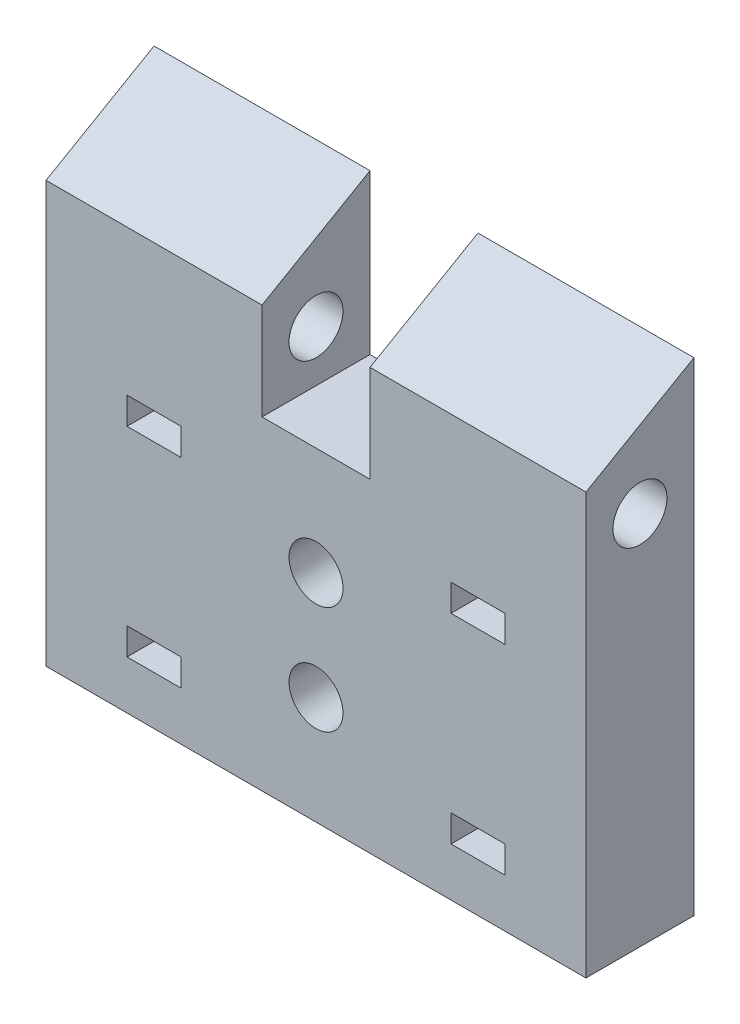
ISO-10303-21;
HEADER;
FILE_DESCRIPTION(('STEP AP214'),'2;1');
FILE_NAME('part.step','',(''),(''),'','','');
FILE_SCHEMA(('AUTOMOTIVE_DESIGN { 1 0 10303 214 1 1 1 1 }'));
ENDSEC;
DATA;
#1=APPLICATION_CONTEXT('core data for automotive mechanical design processes');
#2=APPLICATION_PROTOCOL_DEFINITION('international standard','automotive_design',2000,#1);
#3=PRODUCT_CONTEXT('',#1,'mechanical');
#4=PRODUCT('Part','Part','',(#3));
#5=PRODUCT_RELATED_PRODUCT_CATEGORY('part','',(#4));
#6=PRODUCT_DEFINITION_FORMATION('','',#4);
#7=PRODUCT_DEFINITION_CONTEXT('part definition',#1,'design');
#8=PRODUCT_DEFINITION('design','',#6,#7);
#9=PRODUCT_DEFINITION_SHAPE('','',#8);
#10=(LENGTH_UNIT() NAMED_UNIT(*) SI_UNIT(.MILLI.,.METRE.));
#11=(NAMED_UNIT(*) PLANE_ANGLE_UNIT() SI_UNIT($,.RADIAN.));
#12=(NAMED_UNIT(*) SI_UNIT($,.STERADIAN.) SOLID_ANGLE_UNIT());
#13=UNCERTAINTY_MEASURE_WITH_UNIT(LENGTH_MEASURE(1.E-05),#10,'distance_accuracy_value','');
#14=(GEOMETRIC_REPRESENTATION_CONTEXT(3) GLOBAL_UNCERTAINTY_ASSIGNED_CONTEXT((#13)) GLOBAL_UNIT_ASSIGNED_CONTEXT((#10,
#11,#12)) REPRESENTATION_CONTEXT('',''));
#15=CARTESIAN_POINT('',(0.,0.,0.));
#16=DIRECTION('',(0.,0.,1.));
#17=DIRECTION('',(1.,0.,0.));
#18=AXIS2_PLACEMENT_3D('',#15,#16,#17);
#19=CARTESIAN_POINT('',(0.,-15.,10.));
#20=DIRECTION('',(0.,-1.,0.));
#21=DIRECTION('',(1.,0.,0.));
#22=AXIS2_PLACEMENT_3D('',#19,#20,#21);
#23=PLANE('',#22);
#24=DIRECTION('',(-1.,0.,0.));
#25=VECTOR('',#24,1.);
#26=CARTESIAN_POINT('',(0.,-15.,0.));
#27=LINE('',#26,#25);
#28=CARTESIAN_POINT('',(25.,-15.,0.));
#29=VERTEX_POINT('',#28);
#30=CARTESIAN_POINT('',(-25.,-15.,0.));
#31=VERTEX_POINT('',#30);
#32=EDGE_CURVE('E373',#29,#31,#27,.T.);
#33=ORIENTED_EDGE('',*,*,#32,.F.);
#34=DIRECTION('',(0.,0.,-1.));
#35=VECTOR('',#34,1.);
#36=CARTESIAN_POINT('',(25.,-15.,10.));
#37=LINE('',#36,#35);
#38=CARTESIAN_POINT('',(25.,-15.,10.));
#39=VERTEX_POINT('',#38);
#40=EDGE_CURVE('E11',#39,#29,#37,.T.);
#41=ORIENTED_EDGE('',*,*,#40,.F.);
#42=DIRECTION('',(-1.,0.,0.));
#43=VECTOR('',#42,1.);
#44=CARTESIAN_POINT('',(0.,-15.,10.));
#45=LINE('',#44,#43);
#46=CARTESIAN_POINT('',(-25.,-15.,10.));
#47=VERTEX_POINT('',#46);
#48=EDGE_CURVE('E349',#39,#47,#45,.T.);
#49=ORIENTED_EDGE('',*,*,#48,.T.);
#50=DIRECTION('',(0.,0.,-1.));
#51=VECTOR('',#50,1.);
#52=CARTESIAN_POINT('',(-25.,-15.,10.));
#53=LINE('',#52,#51);
#54=EDGE_CURVE('E367',#47,#31,#53,.T.);
#55=ORIENTED_EDGE('',*,*,#54,.T.);
#56=EDGE_LOOP('',(#33,#41,#49,#55));
#57=FACE_BOUND('',#56,.T.);
#58=ADVANCED_FACE('F35',(#57),#23,.T.);
#59=CARTESIAN_POINT('',(25.,0.,10.));
#60=DIRECTION('',(-1.,0.,0.));
#61=DIRECTION('',(0.,-1.,0.));
#62=AXIS2_PLACEMENT_3D('',#59,#60,#61);
#63=PLANE('',#62);
#64=CARTESIAN_POINT('',(25.,19.75,5.));
#65=DIRECTION('',(-1.,0.,0.));
#66=DIRECTION('',(0.,-1.,0.));
#67=AXIS2_PLACEMENT_3D('',#64,#65,#66);
#68=CIRCLE('',#67,2.5);
#69=CARTESIAN_POINT('',(25.,19.75,7.5));
#70=VERTEX_POINT('',#69);
#71=EDGE_CURVE('E319',#70,#70,#68,.F.);
#72=ORIENTED_EDGE('',*,*,#71,.F.);
#73=EDGE_LOOP('',(#72));
#74=FACE_BOUND('',#73,.T.);
#75=DIRECTION('',(0.,1.,0.));
#76=VECTOR('',#75,1.);
#77=CARTESIAN_POINT('',(25.,0.,0.));
#78=LINE('',#77,#76);
#79=CARTESIAN_POINT('',(25.,29.75,0.));
#80=VERTEX_POINT('',#79);
#81=EDGE_CURVE('E376',#29,#80,#78,.T.);
#82=ORIENTED_EDGE('',*,*,#81,.T.);
#83=DIRECTION('',(0.,0.499999999999994,-0.866025403784442));
#84=VECTOR('',#83,1.);
#85=CARTESIAN_POINT('',(25.,23.9764973081038,10.));
#86=LINE('',#85,#84);
#87=CARTESIAN_POINT('',(25.,23.9764973081038,10.));
#88=VERTEX_POINT('',#87);
#89=EDGE_CURVE('E329',#88,#80,#86,.T.);
#90=ORIENTED_EDGE('',*,*,#89,.F.);
#91=DIRECTION('',(0.,1.,0.));
#92=VECTOR('',#91,1.);
#93=CARTESIAN_POINT('',(25.,0.,10.));
#94=LINE('',#93,#92);
#95=EDGE_CURVE('E352',#39,#88,#94,.T.);
#96=ORIENTED_EDGE('',*,*,#95,.F.);
#97=ORIENTED_EDGE('',*,*,#40,.T.);
#98=EDGE_LOOP('',(#82,#90,#96,#97));
#99=FACE_BOUND('',#98,.T.);
#100=ADVANCED_FACE('F422',(#74,#99),#63,.F.);
#101=CARTESIAN_POINT('',(5.,0.,10.));
#102=DIRECTION('',(-1.,0.,0.));
#103=DIRECTION('',(0.,0.,1.));
#104=AXIS2_PLACEMENT_3D('',#101,#102,#103);
#105=PLANE('',#104);
#106=CARTESIAN_POINT('',(5.,19.75,5.));
#107=DIRECTION('',(-1.,0.,0.));
#108=DIRECTION('',(0.,0.,1.));
#109=AXIS2_PLACEMENT_3D('',#106,#107,#108);
#110=CIRCLE('',#109,2.5);
#111=CARTESIAN_POINT('',(5.,19.75,7.5));
#112=VERTEX_POINT('',#111);
#113=EDGE_CURVE('E325',#112,#112,#110,.T.);
#114=ORIENTED_EDGE('',*,*,#113,.F.);
#115=EDGE_LOOP('',(#114));
#116=FACE_BOUND('',#115,.T.);
#117=DIRECTION('',(0.,-0.499999999999994,0.866025403784442));
#118=VECTOR('',#117,1.);
#119=CARTESIAN_POINT('',(5.,17.982372981078,20.3821278812935));
#120=LINE('',#119,#118);
#121=CARTESIAN_POINT('',(5.00000000000001,29.75,0.));
#122=VERTEX_POINT('',#121);
#123=CARTESIAN_POINT('',(5.00000000000001,23.9764973081038,10.));
#124=VERTEX_POINT('',#123);
#125=EDGE_CURVE('E339',#122,#124,#120,.T.);
#126=ORIENTED_EDGE('',*,*,#125,.F.);
#127=DIRECTION('',(0.,1.,0.));
#128=VECTOR('',#127,1.);
#129=CARTESIAN_POINT('',(5.,0.,0.));
#130=LINE('',#129,#128);
#131=CARTESIAN_POINT('',(5.,15.,0.));
#132=VERTEX_POINT('',#131);
#133=EDGE_CURVE('E382',#132,#122,#130,.T.);
#134=ORIENTED_EDGE('',*,*,#133,.F.);
#135=DIRECTION('',(0.,0.,-1.));
#136=VECTOR('',#135,1.);
#137=CARTESIAN_POINT('',(5.,15.,10.));
#138=LINE('',#137,#136);
#139=CARTESIAN_POINT('',(5.,15.,10.));
#140=VERTEX_POINT('',#139);
#141=EDGE_CURVE('E43',#140,#132,#138,.T.);
#142=ORIENTED_EDGE('',*,*,#141,.F.);
#143=DIRECTION('',(0.,1.,0.));
#144=VECTOR('',#143,1.);
#145=CARTESIAN_POINT('',(5.,0.,10.));
#146=LINE('',#145,#144);
#147=EDGE_CURVE('E355',#140,#124,#146,.T.);
#148=ORIENTED_EDGE('',*,*,#147,.T.);
#149=EDGE_LOOP('',(#126,#134,#142,#148));
#150=FACE_BOUND('',#149,.T.);
#151=ADVANCED_FACE('F405',(#116,#150),#105,.T.);
#152=CARTESIAN_POINT('',(0.,15.,10.));
#153=DIRECTION('',(0.,1.,0.));
#154=DIRECTION('',(0.,0.,1.));
#155=AXIS2_PLACEMENT_3D('',#152,#153,#154);
#156=PLANE('',#155);
#157=DIRECTION('',(1.,0.,0.));
#158=VECTOR('',#157,1.);
#159=CARTESIAN_POINT('',(0.,15.,0.));
#160=LINE('',#159,#158);
#161=CARTESIAN_POINT('',(-5.,15.,0.));
#162=VERTEX_POINT('',#161);
#163=EDGE_CURVE('E385',#162,#132,#160,.T.);
#164=ORIENTED_EDGE('',*,*,#163,.F.);
#165=DIRECTION('',(0.,0.,-1.));
#166=VECTOR('',#165,1.);
#167=CARTESIAN_POINT('',(-5.,15.,10.));
#168=LINE('',#167,#166);
#169=CARTESIAN_POINT('',(-5.,15.,10.));
#170=VERTEX_POINT('',#169);
#171=EDGE_CURVE('E396',#170,#162,#168,.T.);
#172=ORIENTED_EDGE('',*,*,#171,.F.);
#173=DIRECTION('',(1.,0.,0.));
#174=VECTOR('',#173,1.);
#175=CARTESIAN_POINT('',(0.,15.,10.));
#176=LINE('',#175,#174);
#177=EDGE_CURVE('E358',#170,#140,#176,.T.);
#178=ORIENTED_EDGE('',*,*,#177,.T.);
#179=ORIENTED_EDGE('',*,*,#141,.T.);
#180=EDGE_LOOP('',(#164,#172,#178,#179));
#181=FACE_BOUND('',#180,.T.);
#182=ADVANCED_FACE('F400',(#181),#156,.T.);
#183=CARTESIAN_POINT('',(-5.,0.,10.));
#184=DIRECTION('',(-1.,0.,0.));
#185=DIRECTION('',(0.,0.,1.));
#186=AXIS2_PLACEMENT_3D('',#183,#184,#185);
#187=PLANE('',#186);
#188=CARTESIAN_POINT('',(-5.,19.75,5.));
#189=DIRECTION('',(-1.,0.,0.));
#190=DIRECTION('',(0.,0.,1.));
#191=AXIS2_PLACEMENT_3D('',#188,#189,#190);
#192=CIRCLE('',#191,2.5);
#193=CARTESIAN_POINT('',(-5.,19.75,7.5));
#194=VERTEX_POINT('',#193);
#195=EDGE_CURVE('E322',#194,#194,#192,.T.);
#196=ORIENTED_EDGE('',*,*,#195,.T.);
#197=EDGE_LOOP('',(#196));
#198=FACE_BOUND('',#197,.T.);
#199=DIRECTION('',(0.,1.,0.));
#200=VECTOR('',#199,1.);
#201=CARTESIAN_POINT('',(-5.,0.,0.));
#202=LINE('',#201,#200);
#203=CARTESIAN_POINT('',(-5.,29.75,0.));
#204=VERTEX_POINT('',#203);
#205=EDGE_CURVE('E388',#162,#204,#202,.T.);
#206=ORIENTED_EDGE('',*,*,#205,.T.);
#207=DIRECTION('',(0.,-0.499999999999994,0.866025403784442));
#208=VECTOR('',#207,1.);
#209=CARTESIAN_POINT('',(-5.,17.982372981078,20.3821278812935));
#210=LINE('',#209,#208);
#211=CARTESIAN_POINT('',(-4.99999999999999,23.9764973081038,10.));
#212=VERTEX_POINT('',#211);
#213=EDGE_CURVE('E331',#204,#212,#210,.T.);
#214=ORIENTED_EDGE('',*,*,#213,.T.);
#215=DIRECTION('',(0.,1.,0.));
#216=VECTOR('',#215,1.);
#217=CARTESIAN_POINT('',(-5.,0.,10.));
#218=LINE('',#217,#216);
#219=EDGE_CURVE('E361',#170,#212,#218,.T.);
#220=ORIENTED_EDGE('',*,*,#219,.F.);
#221=ORIENTED_EDGE('',*,*,#171,.T.);
#222=EDGE_LOOP('',(#206,#214,#220,#221));
#223=FACE_BOUND('',#222,.T.);
#224=ADVANCED_FACE('F411',(#198,#223),#187,.F.);
#225=CARTESIAN_POINT('',(0.,-5.,10.));
#226=DIRECTION('',(0.,0.,-1.));
#227=DIRECTION('',(-1.,0.,0.));
#228=AXIS2_PLACEMENT_3D('',#225,#226,#227);
#229=CYLINDRICAL_SURFACE('',#228,2.5);
#230=CARTESIAN_POINT('',(0.,-5.,10.));
#231=DIRECTION('',(0.,0.,1.));
#232=DIRECTION('',(1.,0.,0.));
#233=AXIS2_PLACEMENT_3D('',#230,#231,#232);
#234=CIRCLE('',#233,2.5);
#235=CARTESIAN_POINT('',(2.5,-5.,10.));
#236=VERTEX_POINT('',#235);
#237=EDGE_CURVE('E345',#236,#236,#234,.T.);
#238=ORIENTED_EDGE('',*,*,#237,.T.);
#239=EDGE_LOOP('',(#238));
#240=FACE_BOUND('',#239,.T.);
#241=CARTESIAN_POINT('',(0.,-5.,0.));
#242=DIRECTION('',(0.,0.,1.));
#243=DIRECTION('',(1.,0.,0.));
#244=AXIS2_PLACEMENT_3D('',#241,#242,#243);
#245=CIRCLE('',#244,2.5);
#246=CARTESIAN_POINT('',(2.5,-5.,0.));
#247=VERTEX_POINT('',#246);
#248=EDGE_CURVE('E370',#247,#247,#245,.T.);
#249=ORIENTED_EDGE('',*,*,#248,.F.);
#250=EDGE_LOOP('',(#249));
#251=FACE_BOUND('',#250,.T.);
#252=ADVANCED_FACE('F452',(#240,#251),#229,.F.);
#253=CARTESIAN_POINT('',(0.,5.,10.));
#254=DIRECTION('',(0.,0.,-1.));
#255=DIRECTION('',(-1.,0.,0.));
#256=AXIS2_PLACEMENT_3D('',#253,#254,#255);
#257=CYLINDRICAL_SURFACE('',#256,2.5);
#258=CARTESIAN_POINT('',(0.,5.,10.));
#259=DIRECTION('',(0.,0.,1.));
#260=DIRECTION('',(1.,0.,0.));
#261=AXIS2_PLACEMENT_3D('',#258,#259,#260);
#262=CIRCLE('',#261,2.5);
#263=CARTESIAN_POINT('',(2.5,5.,10.));
#264=VERTEX_POINT('',#263);
#265=EDGE_CURVE('E342',#264,#264,#262,.T.);
#266=ORIENTED_EDGE('',*,*,#265,.T.);
#267=EDGE_LOOP('',(#266));
#268=FACE_BOUND('',#267,.T.);
#269=CARTESIAN_POINT('',(0.,5.,0.));
#270=DIRECTION('',(0.,0.,1.));
#271=DIRECTION('',(1.,0.,0.));
#272=AXIS2_PLACEMENT_3D('',#269,#270,#271);
#273=CIRCLE('',#272,2.5);
#274=CARTESIAN_POINT('',(2.5,5.,0.));
#275=VERTEX_POINT('',#274);
#276=EDGE_CURVE('E341',#275,#275,#273,.T.);
#277=ORIENTED_EDGE('',*,*,#276,.F.);
#278=EDGE_LOOP('',(#277));
#279=FACE_BOUND('',#278,.T.);
#280=ADVANCED_FACE('F37',(#268,#279),#257,.F.);
#281=CARTESIAN_POINT('',(-25.,0.,10.));
#282=DIRECTION('',(-1.,0.,0.));
#283=DIRECTION('',(0.,-1.,0.));
#284=AXIS2_PLACEMENT_3D('',#281,#282,#283);
#285=PLANE('',#284);
#286=CARTESIAN_POINT('',(-25.,19.75,5.));
#287=DIRECTION('',(-1.,0.,0.));
#288=DIRECTION('',(0.,0.,1.));
#289=AXIS2_PLACEMENT_3D('',#286,#287,#288);
#290=CIRCLE('',#289,2.5);
#291=CARTESIAN_POINT('',(-25.,19.75,7.5));
#292=VERTEX_POINT('',#291);
#293=EDGE_CURVE('E316',#292,#292,#290,.T.);
#294=ORIENTED_EDGE('',*,*,#293,.F.);
#295=EDGE_LOOP('',(#294));
#296=FACE_BOUND('',#295,.T.);
#297=DIRECTION('',(0.,-0.499999999999994,0.866025403784442));
#298=VECTOR('',#297,1.);
#299=CARTESIAN_POINT('',(-25.,23.9764973081038,10.));
#300=LINE('',#299,#298);
#301=CARTESIAN_POINT('',(-25.,29.75,0.));
#302=VERTEX_POINT('',#301);
#303=CARTESIAN_POINT('',(-25.,23.9764973081038,10.));
#304=VERTEX_POINT('',#303);
#305=EDGE_CURVE('E328',#302,#304,#300,.T.);
#306=ORIENTED_EDGE('',*,*,#305,.F.);
#307=DIRECTION('',(0.,1.,0.));
#308=VECTOR('',#307,1.);
#309=CARTESIAN_POINT('',(-25.,0.,0.));
#310=LINE('',#309,#308);
#311=EDGE_CURVE('E346',#31,#302,#310,.T.);
#312=ORIENTED_EDGE('',*,*,#311,.F.);
#313=ORIENTED_EDGE('',*,*,#54,.F.);
#314=DIRECTION('',(0.,1.,0.));
#315=VECTOR('',#314,1.);
#316=CARTESIAN_POINT('',(-25.,0.,10.));
#317=LINE('',#316,#315);
#318=EDGE_CURVE('E364',#47,#304,#317,.T.);
#319=ORIENTED_EDGE('',*,*,#318,.T.);
#320=EDGE_LOOP('',(#306,#312,#313,#319));
#321=FACE_BOUND('',#320,.T.);
#322=ADVANCED_FACE('F430',(#296,#321),#285,.T.);
#323=CARTESIAN_POINT('',(0.,0.,10.));
#324=DIRECTION('',(0.,0.,1.));
#325=DIRECTION('',(1.,0.,0.));
#326=AXIS2_PLACEMENT_3D('',#323,#324,#325);
#327=PLANE('',#326);
#328=DIRECTION('',(0.,1.,0.));
#329=VECTOR('',#328,1.);
#330=CARTESIAN_POINT('',(-12.5,-10.5,10.));
#331=LINE('',#330,#329);
#332=CARTESIAN_POINT('',(-12.5,-10.5,10.));
#333=VERTEX_POINT('',#332);
#334=CARTESIAN_POINT('',(-12.5,-8.,10.));
#335=VERTEX_POINT('',#334);
#336=EDGE_CURVE('E50',#333,#335,#331,.T.);
#337=ORIENTED_EDGE('',*,*,#336,.F.);
#338=DIRECTION('',(1.,0.,0.));
#339=VECTOR('',#338,1.);
#340=CARTESIAN_POINT('',(-17.5,-10.5,10.));
#341=LINE('',#340,#339);
#342=CARTESIAN_POINT('',(-17.5,-10.5,10.));
#343=VERTEX_POINT('',#342);
#344=EDGE_CURVE('E219',#343,#333,#341,.T.);
#345=ORIENTED_EDGE('',*,*,#344,.F.);
#346=DIRECTION('',(0.,-1.,0.));
#347=VECTOR('',#346,1.);
#348=CARTESIAN_POINT('',(-17.5,-10.5,10.));
#349=LINE('',#348,#347);
#350=CARTESIAN_POINT('',(-17.5,-8.,10.));
#351=VERTEX_POINT('',#350);
#352=EDGE_CURVE('E202',#351,#343,#349,.T.);
#353=ORIENTED_EDGE('',*,*,#352,.F.);
#354=DIRECTION('',(-1.,0.,0.));
#355=VECTOR('',#354,1.);
#356=CARTESIAN_POINT('',(-17.5,-8.,10.));
#357=LINE('',#356,#355);
#358=EDGE_CURVE('E212',#335,#351,#357,.T.);
#359=ORIENTED_EDGE('',*,*,#358,.F.);
#360=EDGE_LOOP('',(#337,#345,#353,#359));
#361=FACE_BOUND('',#360,.T.);
#362=DIRECTION('',(1.,0.,0.));
#363=VECTOR('',#362,1.);
#364=CARTESIAN_POINT('',(17.5,-10.5,10.));
#365=LINE('',#364,#363);
#366=CARTESIAN_POINT('',(12.5,-10.5,10.));
#367=VERTEX_POINT('',#366);
#368=CARTESIAN_POINT('',(17.5,-10.5,10.));
#369=VERTEX_POINT('',#368);
#370=EDGE_CURVE('E58',#367,#369,#365,.T.);
#371=ORIENTED_EDGE('',*,*,#370,.F.);
#372=DIRECTION('',(0.,-1.,0.));
#373=VECTOR('',#372,1.);
#374=CARTESIAN_POINT('',(12.5,-10.5,10.));
#375=LINE('',#374,#373);
#376=CARTESIAN_POINT('',(12.5,-8.,10.));
#377=VERTEX_POINT('',#376);
#378=EDGE_CURVE('E249',#377,#367,#375,.T.);
#379=ORIENTED_EDGE('',*,*,#378,.F.);
#380=DIRECTION('',(-1.,0.,0.));
#381=VECTOR('',#380,1.);
#382=CARTESIAN_POINT('',(17.5,-8.,10.));
#383=LINE('',#382,#381);
#384=CARTESIAN_POINT('',(17.5,-8.,10.));
#385=VERTEX_POINT('',#384);
#386=EDGE_CURVE('E246',#385,#377,#383,.T.);
#387=ORIENTED_EDGE('',*,*,#386,.F.);
#388=DIRECTION('',(0.,1.,0.));
#389=VECTOR('',#388,1.);
#390=CARTESIAN_POINT('',(17.5,-10.5,10.));
#391=LINE('',#390,#389);
#392=EDGE_CURVE('E242',#369,#385,#391,.T.);
#393=ORIENTED_EDGE('',*,*,#392,.F.);
#394=EDGE_LOOP('',(#371,#379,#387,#393));
#395=FACE_BOUND('',#394,.T.);
#396=DIRECTION('',(-1.,0.,0.));
#397=VECTOR('',#396,1.);
#398=CARTESIAN_POINT('',(17.5,10.5,10.));
#399=LINE('',#398,#397);
#400=CARTESIAN_POINT('',(17.5,10.5,10.));
#401=VERTEX_POINT('',#400);
#402=CARTESIAN_POINT('',(12.5,10.5,10.));
#403=VERTEX_POINT('',#402);
#404=EDGE_CURVE('E268',#401,#403,#399,.T.);
#405=ORIENTED_EDGE('',*,*,#404,.F.);
#406=DIRECTION('',(0.,1.,0.));
#407=VECTOR('',#406,1.);
#408=CARTESIAN_POINT('',(17.5,8.,10.));
#409=LINE('',#408,#407);
#410=CARTESIAN_POINT('',(17.5,8.,10.));
#411=VERTEX_POINT('',#410);
#412=EDGE_CURVE('E276',#411,#401,#409,.T.);
#413=ORIENTED_EDGE('',*,*,#412,.F.);
#414=DIRECTION('',(1.,0.,0.));
#415=VECTOR('',#414,1.);
#416=CARTESIAN_POINT('',(17.5,8.,10.));
#417=LINE('',#416,#415);
#418=CARTESIAN_POINT('',(12.5,8.,10.));
#419=VERTEX_POINT('',#418);
#420=EDGE_CURVE('E273',#419,#411,#417,.T.);
#421=ORIENTED_EDGE('',*,*,#420,.F.);
#422=DIRECTION('',(0.,-1.,0.));
#423=VECTOR('',#422,1.);
#424=CARTESIAN_POINT('',(12.5,8.,10.));
#425=LINE('',#424,#423);
#426=EDGE_CURVE('E270',#403,#419,#425,.T.);
#427=ORIENTED_EDGE('',*,*,#426,.F.);
#428=EDGE_LOOP('',(#405,#413,#421,#427));
#429=FACE_BOUND('',#428,.T.);
#430=DIRECTION('',(0.,1.,0.));
#431=VECTOR('',#430,1.);
#432=CARTESIAN_POINT('',(-12.5,8.,10.));
#433=LINE('',#432,#431);
#434=CARTESIAN_POINT('',(-12.5,8.,10.));
#435=VERTEX_POINT('',#434);
#436=CARTESIAN_POINT('',(-12.5,10.5,10.));
#437=VERTEX_POINT('',#436);
#438=EDGE_CURVE('E230',#435,#437,#433,.T.);
#439=ORIENTED_EDGE('',*,*,#438,.F.);
#440=DIRECTION('',(1.,0.,0.));
#441=VECTOR('',#440,1.);
#442=CARTESIAN_POINT('',(-17.5,8.,10.));
#443=LINE('',#442,#441);
#444=CARTESIAN_POINT('',(-17.5,8.,10.));
#445=VERTEX_POINT('',#444);
#446=EDGE_CURVE('E304',#445,#435,#443,.T.);
#447=ORIENTED_EDGE('',*,*,#446,.F.);
#448=DIRECTION('',(0.,-1.,0.));
#449=VECTOR('',#448,1.);
#450=CARTESIAN_POINT('',(-17.5,8.,10.));
#451=LINE('',#450,#449);
#452=CARTESIAN_POINT('',(-17.5,10.5,10.));
#453=VERTEX_POINT('',#452);
#454=EDGE_CURVE('E301',#453,#445,#451,.T.);
#455=ORIENTED_EDGE('',*,*,#454,.F.);
#456=DIRECTION('',(-1.,0.,0.));
#457=VECTOR('',#456,1.);
#458=CARTESIAN_POINT('',(-17.5,10.5,10.));
#459=LINE('',#458,#457);
#460=EDGE_CURVE('E298',#437,#453,#459,.T.);
#461=ORIENTED_EDGE('',*,*,#460,.F.);
#462=EDGE_LOOP('',(#439,#447,#455,#461));
#463=FACE_BOUND('',#462,.T.);
#464=DIRECTION('',(-1.,0.,0.));
#465=VECTOR('',#464,1.);
#466=CARTESIAN_POINT('',(36.5470053837925,23.9764973081038,10.));
#467=LINE('',#466,#465);
#468=EDGE_CURVE('E334',#212,#304,#467,.T.);
#469=ORIENTED_EDGE('',*,*,#468,.T.);
#470=ORIENTED_EDGE('',*,*,#318,.F.);
#471=ORIENTED_EDGE('',*,*,#48,.F.);
#472=ORIENTED_EDGE('',*,*,#95,.T.);
#473=EDGE_CURVE('E332',#88,#124,#467,.T.);
#474=ORIENTED_EDGE('',*,*,#473,.T.);
#475=ORIENTED_EDGE('',*,*,#147,.F.);
#476=ORIENTED_EDGE('',*,*,#177,.F.);
#477=ORIENTED_EDGE('',*,*,#219,.T.);
#478=EDGE_LOOP('',(#469,#470,#471,#472,#474,#475,#476,#477));
#479=FACE_BOUND('',#478,.T.);
#480=ORIENTED_EDGE('',*,*,#265,.F.);
#481=EDGE_LOOP('',(#480));
#482=FACE_BOUND('',#481,.T.);
#483=ORIENTED_EDGE('',*,*,#237,.F.);
#484=EDGE_LOOP('',(#483));
#485=FACE_BOUND('',#484,.T.);
#486=ADVANCED_FACE('F216',(#361,#395,#429,#463,#479,#482,#485),#327,.T.);
#487=CARTESIAN_POINT('',(0.,0.,0.));
#488=DIRECTION('',(0.,0.,1.));
#489=DIRECTION('',(1.,0.,0.));
#490=AXIS2_PLACEMENT_3D('',#487,#488,#489);
#491=PLANE('',#490);
#492=DIRECTION('',(-1.,0.,0.));
#493=VECTOR('',#492,1.);
#494=CARTESIAN_POINT('',(-17.5,-10.5,0.));
#495=LINE('',#494,#493);
#496=CARTESIAN_POINT('',(-12.5,-10.5,0.));
#497=VERTEX_POINT('',#496);
#498=CARTESIAN_POINT('',(-17.5,-10.5,0.));
#499=VERTEX_POINT('',#498);
#500=EDGE_CURVE('E551',#497,#499,#495,.T.);
#501=ORIENTED_EDGE('',*,*,#500,.F.);
#502=DIRECTION('',(0.,-1.,0.));
#503=VECTOR('',#502,1.);
#504=CARTESIAN_POINT('',(-12.5,-10.5,0.));
#505=LINE('',#504,#503);
#506=CARTESIAN_POINT('',(-12.5,-8.,0.));
#507=VERTEX_POINT('',#506);
#508=EDGE_CURVE('E231',#507,#497,#505,.T.);
#509=ORIENTED_EDGE('',*,*,#508,.F.);
#510=DIRECTION('',(1.,0.,0.));
#511=VECTOR('',#510,1.);
#512=CARTESIAN_POINT('',(-17.5,-8.,0.));
#513=LINE('',#512,#511);
#514=CARTESIAN_POINT('',(-17.5,-8.,0.));
#515=VERTEX_POINT('',#514);
#516=EDGE_CURVE('E228',#515,#507,#513,.T.);
#517=ORIENTED_EDGE('',*,*,#516,.F.);
#518=DIRECTION('',(0.,1.,0.));
#519=VECTOR('',#518,1.);
#520=CARTESIAN_POINT('',(-17.5,-10.5,0.));
#521=LINE('',#520,#519);
#522=EDGE_CURVE('E205',#499,#515,#521,.T.);
#523=ORIENTED_EDGE('',*,*,#522,.F.);
#524=EDGE_LOOP('',(#501,#509,#517,#523));
#525=FACE_BOUND('',#524,.T.);
#526=DIRECTION('',(0.,1.,0.));
#527=VECTOR('',#526,1.);
#528=CARTESIAN_POINT('',(12.5,-10.5,0.));
#529=LINE('',#528,#527);
#530=CARTESIAN_POINT('',(12.5,-10.5,0.));
#531=VERTEX_POINT('',#530);
#532=CARTESIAN_POINT('',(12.5,-8.,0.));
#533=VERTEX_POINT('',#532);
#534=EDGE_CURVE('E235',#531,#533,#529,.T.);
#535=ORIENTED_EDGE('',*,*,#534,.F.);
#536=DIRECTION('',(-1.,0.,0.));
#537=VECTOR('',#536,1.);
#538=CARTESIAN_POINT('',(17.5,-10.5,0.));
#539=LINE('',#538,#537);
#540=CARTESIAN_POINT('',(17.5,-10.5,0.));
#541=VERTEX_POINT('',#540);
#542=EDGE_CURVE('E238',#541,#531,#539,.T.);
#543=ORIENTED_EDGE('',*,*,#542,.F.);
#544=DIRECTION('',(0.,-1.,0.));
#545=VECTOR('',#544,1.);
#546=CARTESIAN_POINT('',(17.5,-10.5,0.));
#547=LINE('',#546,#545);
#548=CARTESIAN_POINT('',(17.5,-8.,0.));
#549=VERTEX_POINT('',#548);
#550=EDGE_CURVE('E240',#549,#541,#547,.T.);
#551=ORIENTED_EDGE('',*,*,#550,.F.);
#552=DIRECTION('',(1.,0.,0.));
#553=VECTOR('',#552,1.);
#554=CARTESIAN_POINT('',(17.5,-8.,0.));
#555=LINE('',#554,#553);
#556=EDGE_CURVE('E232',#533,#549,#555,.T.);
#557=ORIENTED_EDGE('',*,*,#556,.F.);
#558=EDGE_LOOP('',(#535,#543,#551,#557));
#559=FACE_BOUND('',#558,.T.);
#560=DIRECTION('',(0.,-1.,0.));
#561=VECTOR('',#560,1.);
#562=CARTESIAN_POINT('',(17.5,8.,0.));
#563=LINE('',#562,#561);
#564=CARTESIAN_POINT('',(17.5,10.5,0.));
#565=VERTEX_POINT('',#564);
#566=CARTESIAN_POINT('',(17.5,8.,0.));
#567=VERTEX_POINT('',#566);
#568=EDGE_CURVE('E263',#565,#567,#563,.T.);
#569=ORIENTED_EDGE('',*,*,#568,.F.);
#570=DIRECTION('',(1.,0.,0.));
#571=VECTOR('',#570,1.);
#572=CARTESIAN_POINT('',(17.5,10.5,0.));
#573=LINE('',#572,#571);
#574=CARTESIAN_POINT('',(12.5,10.5,0.));
#575=VERTEX_POINT('',#574);
#576=EDGE_CURVE('E266',#575,#565,#573,.T.);
#577=ORIENTED_EDGE('',*,*,#576,.F.);
#578=DIRECTION('',(0.,1.,0.));
#579=VECTOR('',#578,1.);
#580=CARTESIAN_POINT('',(12.5,8.,0.));
#581=LINE('',#580,#579);
#582=CARTESIAN_POINT('',(12.5,8.,0.));
#583=VERTEX_POINT('',#582);
#584=EDGE_CURVE('E243',#583,#575,#581,.T.);
#585=ORIENTED_EDGE('',*,*,#584,.F.);
#586=DIRECTION('',(-1.,0.,0.));
#587=VECTOR('',#586,1.);
#588=CARTESIAN_POINT('',(17.5,8.,0.));
#589=LINE('',#588,#587);
#590=EDGE_CURVE('E260',#567,#583,#589,.T.);
#591=ORIENTED_EDGE('',*,*,#590,.F.);
#592=EDGE_LOOP('',(#569,#577,#585,#591));
#593=FACE_BOUND('',#592,.T.);
#594=DIRECTION('',(-1.,0.,0.));
#595=VECTOR('',#594,1.);
#596=CARTESIAN_POINT('',(-17.5,8.,0.));
#597=LINE('',#596,#595);
#598=CARTESIAN_POINT('',(-12.5,8.,0.));
#599=VERTEX_POINT('',#598);
#600=CARTESIAN_POINT('',(-17.5,8.,0.));
#601=VERTEX_POINT('',#600);
#602=EDGE_CURVE('E291',#599,#601,#597,.T.);
#603=ORIENTED_EDGE('',*,*,#602,.F.);
#604=DIRECTION('',(0.,-1.,0.));
#605=VECTOR('',#604,1.);
#606=CARTESIAN_POINT('',(-12.5,8.,0.));
#607=LINE('',#606,#605);
#608=CARTESIAN_POINT('',(-12.5,10.5,0.));
#609=VERTEX_POINT('',#608);
#610=EDGE_CURVE('E294',#609,#599,#607,.T.);
#611=ORIENTED_EDGE('',*,*,#610,.F.);
#612=DIRECTION('',(1.,0.,0.));
#613=VECTOR('',#612,1.);
#614=CARTESIAN_POINT('',(-17.5,10.5,0.));
#615=LINE('',#614,#613);
#616=CARTESIAN_POINT('',(-17.5,10.5,0.));
#617=VERTEX_POINT('',#616);
#618=EDGE_CURVE('E296',#617,#609,#615,.T.);
#619=ORIENTED_EDGE('',*,*,#618,.F.);
#620=DIRECTION('',(0.,1.,0.));
#621=VECTOR('',#620,1.);
#622=CARTESIAN_POINT('',(-17.5,8.,0.));
#623=LINE('',#622,#621);
#624=EDGE_CURVE('E288',#601,#617,#623,.T.);
#625=ORIENTED_EDGE('',*,*,#624,.F.);
#626=EDGE_LOOP('',(#603,#611,#619,#625));
#627=FACE_BOUND('',#626,.T.);
#628=ORIENTED_EDGE('',*,*,#276,.T.);
#629=EDGE_LOOP('',(#628));
#630=FACE_BOUND('',#629,.T.);
#631=ORIENTED_EDGE('',*,*,#248,.T.);
#632=EDGE_LOOP('',(#631));
#633=FACE_BOUND('',#632,.T.);
#634=ORIENTED_EDGE('',*,*,#32,.T.);
#635=ORIENTED_EDGE('',*,*,#311,.T.);
#636=DIRECTION('',(-1.,0.,0.));
#637=VECTOR('',#636,1.);
#638=CARTESIAN_POINT('',(0.,29.75,0.));
#639=LINE('',#638,#637);
#640=EDGE_CURVE('E391',#204,#302,#639,.T.);
#641=ORIENTED_EDGE('',*,*,#640,.F.);
#642=ORIENTED_EDGE('',*,*,#205,.F.);
#643=ORIENTED_EDGE('',*,*,#163,.T.);
#644=ORIENTED_EDGE('',*,*,#133,.T.);
#645=DIRECTION('',(1.,0.,0.));
#646=VECTOR('',#645,1.);
#647=CARTESIAN_POINT('',(0.,29.75,0.));
#648=LINE('',#647,#646);
#649=EDGE_CURVE('E379',#122,#80,#648,.T.);
#650=ORIENTED_EDGE('',*,*,#649,.T.);
#651=ORIENTED_EDGE('',*,*,#81,.F.);
#652=EDGE_LOOP('',(#634,#635,#641,#642,#643,#644,#650,#651));
#653=FACE_BOUND('',#652,.T.);
#654=ADVANCED_FACE('F408',(#525,#559,#593,#627,#630,#633,#653),#491,.F.);
#655=CARTESIAN_POINT('',(36.5470053837925,23.9764973081038,10.));
#656=DIRECTION('',(0.,-0.866025403784442,-0.499999999999994));
#657=DIRECTION('',(0.,0.499999999999994,-0.866025403784442));
#658=AXIS2_PLACEMENT_3D('',#655,#656,#657);
#659=PLANE('',#658);
#660=ORIENTED_EDGE('',*,*,#640,.T.);
#661=ORIENTED_EDGE('',*,*,#305,.T.);
#662=ORIENTED_EDGE('',*,*,#468,.F.);
#663=ORIENTED_EDGE('',*,*,#213,.F.);
#664=EDGE_LOOP('',(#660,#661,#662,#663));
#665=FACE_BOUND('',#664,.T.);
#666=ADVANCED_FACE('F432',(#665),#659,.F.);
#667=ORIENTED_EDGE('',*,*,#125,.T.);
#668=ORIENTED_EDGE('',*,*,#473,.F.);
#669=ORIENTED_EDGE('',*,*,#89,.T.);
#670=ORIENTED_EDGE('',*,*,#649,.F.);
#671=EDGE_LOOP('',(#667,#668,#669,#670));
#672=FACE_BOUND('',#671,.T.);
#673=ADVANCED_FACE('F420',(#672),#659,.F.);
#674=CARTESIAN_POINT('',(36.5470053837925,19.75,5.));
#675=DIRECTION('',(-1.,0.,0.));
#676=DIRECTION('',(0.,0.,1.));
#677=AXIS2_PLACEMENT_3D('',#674,#675,#676);
#678=CYLINDRICAL_SURFACE('',#677,2.5);
#679=CARTESIAN_POINT('',(-25.,19.75,7.5));
#680=CARTESIAN_POINT('',(-24.7916666666667,19.75,7.5));
#681=CARTESIAN_POINT('',(-24.5833333333333,19.75,7.5));
#682=CARTESIAN_POINT('',(-24.1666666666667,19.75,7.5));
#683=CARTESIAN_POINT('',(-23.9583333333333,19.75,7.5));
#684=CARTESIAN_POINT('',(-23.5416666666667,19.75,7.5));
#685=CARTESIAN_POINT('',(-23.3333333333333,19.75,7.5));
#686=CARTESIAN_POINT('',(-22.9166666666667,19.75,7.5));
#687=CARTESIAN_POINT('',(-22.7083333333333,19.75,7.5));
#688=CARTESIAN_POINT('',(-22.2916666666667,19.75,7.5));
#689=CARTESIAN_POINT('',(-22.0833333333333,19.75,7.5));
#690=CARTESIAN_POINT('',(-21.6666666666667,19.75,7.5));
#691=CARTESIAN_POINT('',(-21.4583333333333,19.75,7.5));
#692=CARTESIAN_POINT('',(-21.0416666666667,19.75,7.5));
#693=CARTESIAN_POINT('',(-20.8333333333333,19.75,7.5));
#694=CARTESIAN_POINT('',(-20.4166666666667,19.75,7.5));
#695=CARTESIAN_POINT('',(-20.2083333333333,19.75,7.5));
#696=CARTESIAN_POINT('',(-19.7916666666667,19.75,7.5));
#697=CARTESIAN_POINT('',(-19.5833333333333,19.75,7.5));
#698=CARTESIAN_POINT('',(-19.1666666666667,19.75,7.5));
#699=CARTESIAN_POINT('',(-18.9583333333333,19.75,7.5));
#700=CARTESIAN_POINT('',(-18.5416666666667,19.75,7.5));
#701=CARTESIAN_POINT('',(-18.3333333333333,19.75,7.5));
#702=CARTESIAN_POINT('',(-17.9166666666667,19.75,7.5));
#703=CARTESIAN_POINT('',(-17.7083333333333,19.75,7.5));
#704=CARTESIAN_POINT('',(-17.2916666666667,19.75,7.5));
#705=CARTESIAN_POINT('',(-17.0833333333333,19.75,7.5));
#706=CARTESIAN_POINT('',(-16.6666666666667,19.75,7.5));
#707=CARTESIAN_POINT('',(-16.4583333333333,19.75,7.5));
#708=CARTESIAN_POINT('',(-16.0416666666667,19.75,7.5));
#709=CARTESIAN_POINT('',(-15.8333333333333,19.75,7.5));
#710=CARTESIAN_POINT('',(-15.4166666666667,19.75,7.5));
#711=CARTESIAN_POINT('',(-15.2083333333333,19.75,7.5));
#712=CARTESIAN_POINT('',(-14.7916666666667,19.75,7.5));
#713=CARTESIAN_POINT('',(-14.5833333333333,19.75,7.5));
#714=CARTESIAN_POINT('',(-14.1666666666667,19.75,7.5));
#715=CARTESIAN_POINT('',(-13.9583333333333,19.75,7.5));
#716=CARTESIAN_POINT('',(-13.5416666666667,19.75,7.5));
#717=CARTESIAN_POINT('',(-13.3333333333333,19.75,7.5));
#718=CARTESIAN_POINT('',(-12.9166666666667,19.75,7.5));
#719=CARTESIAN_POINT('',(-12.7083333333333,19.75,7.5));
#720=CARTESIAN_POINT('',(-12.2916666666667,19.75,7.5));
#721=CARTESIAN_POINT('',(-12.0833333333333,19.75,7.5));
#722=CARTESIAN_POINT('',(-11.6666666666667,19.75,7.5));
#723=CARTESIAN_POINT('',(-11.4583333333333,19.75,7.5));
#724=CARTESIAN_POINT('',(-11.0416666666667,19.75,7.5));
#725=CARTESIAN_POINT('',(-10.8333333333333,19.75,7.5));
#726=CARTESIAN_POINT('',(-10.4166666666667,19.75,7.5));
#727=CARTESIAN_POINT('',(-10.2083333333333,19.75,7.5));
#728=CARTESIAN_POINT('',(-9.79166666666666,19.75,7.5));
#729=CARTESIAN_POINT('',(-9.58333333333333,19.75,7.5));
#730=CARTESIAN_POINT('',(-9.16666666666666,19.75,7.5));
#731=CARTESIAN_POINT('',(-8.95833333333333,19.75,7.5));
#732=CARTESIAN_POINT('',(-8.54166666666666,19.75,7.5));
#733=CARTESIAN_POINT('',(-8.33333333333333,19.75,7.5));
#734=CARTESIAN_POINT('',(-7.91666666666667,19.75,7.5));
#735=CARTESIAN_POINT('',(-7.70833333333333,19.75,7.5));
#736=CARTESIAN_POINT('',(-7.29166666666667,19.75,7.5));
#737=CARTESIAN_POINT('',(-7.08333333333333,19.75,7.5));
#738=CARTESIAN_POINT('',(-6.66666666666667,19.75,7.5));
#739=CARTESIAN_POINT('',(-6.45833333333333,19.75,7.5));
#740=CARTESIAN_POINT('',(-6.04166666666667,19.75,7.5));
#741=CARTESIAN_POINT('',(-5.83333333333333,19.75,7.5));
#742=CARTESIAN_POINT('',(-5.41666666666666,19.75,7.5));
#743=CARTESIAN_POINT('',(-5.20833333333333,19.75,7.5));
#744=CARTESIAN_POINT('',(-5.,19.75,7.5));
#745=B_SPLINE_CURVE_WITH_KNOTS('',3,(#679,#680,#681,#682,#683,#684,#685,#686,#687,#688,#689,
#690,#691,#692,#693,#694,#695,#696,#697,#698,#699,#700,#701,#702,#703,#704,#705,#706,#707,#708,
#709,#710,#711,#712,#713,#714,#715,#716,#717,#718,#719,#720,#721,#722,#723,#724,#725,#726,#727,
#728,#729,#730,#731,#732,#733,#734,#735,#736,#737,#738,#739,#740,#741,#742,#743,#744),
.UNSPECIFIED.,.F.,.F.,(4,2,2,2,2,2,2,2,2,2,2,2,2,2,2,2,2,2,2,2,2,2,2,2,2,2,2,2,2,2,2,2,4),(0.,
0.625000000000001,1.25,1.875,2.5,3.125,3.75,4.375,5.,5.625,6.25,6.875,7.49999999999999,
8.12499999999999,8.74999999999999,9.37499999999999,9.99999999999999,10.625,11.25,11.875,12.5,
13.125,13.75,14.375,15.,15.625,16.25,16.875,17.5,18.125,18.75,19.375,20.),.UNSPECIFIED.);
#746=EDGE_CURVE('BSEAM439',#292,#194,#745,.T.);
#747=ORIENTED_EDGE('',*,*,#293,.T.);
#748=ORIENTED_EDGE('',*,*,#195,.F.);
#749=ORIENTED_EDGE('',*,*,#746,.T.);
#750=ORIENTED_EDGE('',*,*,#746,.F.);
#751=EDGE_LOOP('',(#747,#749,#748,#750));
#752=FACE_BOUND('',#751,.T.);
#753=ADVANCED_FACE('F439',(#752),#678,.F.);
#754=CARTESIAN_POINT('',(5.,19.75,7.5));
#755=CARTESIAN_POINT('',(5.20833333333333,19.75,7.5));
#756=CARTESIAN_POINT('',(5.41666666666666,19.75,7.5));
#757=CARTESIAN_POINT('',(5.83333333333333,19.75,7.5));
#758=CARTESIAN_POINT('',(6.04166666666666,19.75,7.5));
#759=CARTESIAN_POINT('',(6.45833333333333,19.75,7.5));
#760=CARTESIAN_POINT('',(6.66666666666666,19.75,7.5));
#761=CARTESIAN_POINT('',(7.08333333333333,19.75,7.5));
#762=CARTESIAN_POINT('',(7.29166666666666,19.75,7.5));
#763=CARTESIAN_POINT('',(7.70833333333333,19.75,7.5));
#764=CARTESIAN_POINT('',(7.91666666666666,19.75,7.5));
#765=CARTESIAN_POINT('',(8.33333333333333,19.75,7.5));
#766=CARTESIAN_POINT('',(8.54166666666666,19.75,7.5));
#767=CARTESIAN_POINT('',(8.95833333333333,19.75,7.5));
#768=CARTESIAN_POINT('',(9.16666666666666,19.75,7.5));
#769=CARTESIAN_POINT('',(9.58333333333333,19.75,7.5));
#770=CARTESIAN_POINT('',(9.79166666666666,19.75,7.5));
#771=CARTESIAN_POINT('',(10.2083333333333,19.75,7.5));
#772=CARTESIAN_POINT('',(10.4166666666667,19.75,7.5));
#773=CARTESIAN_POINT('',(10.8333333333333,19.75,7.5));
#774=CARTESIAN_POINT('',(11.0416666666667,19.75,7.5));
#775=CARTESIAN_POINT('',(11.4583333333333,19.75,7.5));
#776=CARTESIAN_POINT('',(11.6666666666667,19.75,7.5));
#777=CARTESIAN_POINT('',(12.0833333333333,19.75,7.5));
#778=CARTESIAN_POINT('',(12.2916666666667,19.75,7.5));
#779=CARTESIAN_POINT('',(12.7083333333333,19.75,7.5));
#780=CARTESIAN_POINT('',(12.9166666666667,19.75,7.5));
#781=CARTESIAN_POINT('',(13.3333333333333,19.75,7.5));
#782=CARTESIAN_POINT('',(13.5416666666667,19.75,7.5));
#783=CARTESIAN_POINT('',(13.9583333333333,19.75,7.5));
#784=CARTESIAN_POINT('',(14.1666666666667,19.75,7.5));
#785=CARTESIAN_POINT('',(14.5833333333333,19.75,7.5));
#786=CARTESIAN_POINT('',(14.7916666666667,19.75,7.5));
#787=CARTESIAN_POINT('',(15.2083333333333,19.75,7.5));
#788=CARTESIAN_POINT('',(15.4166666666667,19.75,7.5));
#789=CARTESIAN_POINT('',(15.8333333333333,19.75,7.5));
#790=CARTESIAN_POINT('',(16.0416666666667,19.75,7.5));
#791=CARTESIAN_POINT('',(16.4583333333333,19.75,7.5));
#792=CARTESIAN_POINT('',(16.6666666666667,19.75,7.5));
#793=CARTESIAN_POINT('',(17.0833333333333,19.75,7.5));
#794=CARTESIAN_POINT('',(17.2916666666667,19.75,7.5));
#795=CARTESIAN_POINT('',(17.7083333333333,19.75,7.5));
#796=CARTESIAN_POINT('',(17.9166666666667,19.75,7.5));
#797=CARTESIAN_POINT('',(18.3333333333333,19.75,7.5));
#798=CARTESIAN_POINT('',(18.5416666666667,19.75,7.5));
#799=CARTESIAN_POINT('',(18.9583333333333,19.75,7.5));
#800=CARTESIAN_POINT('',(19.1666666666667,19.75,7.5));
#801=CARTESIAN_POINT('',(19.5833333333333,19.75,7.5));
#802=CARTESIAN_POINT('',(19.7916666666667,19.75,7.5));
#803=CARTESIAN_POINT('',(20.2083333333333,19.75,7.5));
#804=CARTESIAN_POINT('',(20.4166666666667,19.75,7.5));
#805=CARTESIAN_POINT('',(20.8333333333333,19.75,7.5));
#806=CARTESIAN_POINT('',(21.0416666666667,19.75,7.5));
#807=CARTESIAN_POINT('',(21.4583333333333,19.75,7.5));
#808=CARTESIAN_POINT('',(21.6666666666667,19.75,7.5));
#809=CARTESIAN_POINT('',(22.0833333333333,19.75,7.5));
#810=CARTESIAN_POINT('',(22.2916666666667,19.75,7.5));
#811=CARTESIAN_POINT('',(22.7083333333333,19.75,7.5));
#812=CARTESIAN_POINT('',(22.9166666666667,19.75,7.5));
#813=CARTESIAN_POINT('',(23.3333333333333,19.75,7.5));
#814=CARTESIAN_POINT('',(23.5416666666667,19.75,7.5));
#815=CARTESIAN_POINT('',(23.9583333333333,19.75,7.5));
#816=CARTESIAN_POINT('',(24.1666666666667,19.75,7.5));
#817=CARTESIAN_POINT('',(24.5833333333333,19.75,7.5));
#818=CARTESIAN_POINT('',(24.7916666666667,19.75,7.5));
#819=CARTESIAN_POINT('',(25.,19.75,7.5));
#820=B_SPLINE_CURVE_WITH_KNOTS('',3,(#754,#755,#756,#757,#758,#759,#760,#761,#762,#763,#764,
#765,#766,#767,#768,#769,#770,#771,#772,#773,#774,#775,#776,#777,#778,#779,#780,#781,#782,#783,
#784,#785,#786,#787,#788,#789,#790,#791,#792,#793,#794,#795,#796,#797,#798,#799,#800,#801,#802,
#803,#804,#805,#806,#807,#808,#809,#810,#811,#812,#813,#814,#815,#816,#817,#818,#819),
.UNSPECIFIED.,.F.,.F.,(4,2,2,2,2,2,2,2,2,2,2,2,2,2,2,2,2,2,2,2,2,2,2,2,2,2,2,2,2,2,2,2,4),(0.,
0.624999999999997,1.25,1.875,2.5,3.125,3.75,4.375,5.,5.625,6.25,6.875,7.5,8.125,8.75,9.375,10.,
10.625,11.25,11.875,12.5,13.125,13.75,14.375,15.,15.625,16.25,16.875,17.5,18.125,18.75,19.375,
20.),.UNSPECIFIED.);
#821=EDGE_CURVE('BSEAM481',#112,#70,#820,.T.);
#822=ORIENTED_EDGE('',*,*,#113,.T.);
#823=ORIENTED_EDGE('',*,*,#71,.T.);
#824=ORIENTED_EDGE('',*,*,#821,.T.);
#825=ORIENTED_EDGE('',*,*,#821,.F.);
#826=EDGE_LOOP('',(#822,#824,#823,#825));
#827=FACE_BOUND('',#826,.T.);
#828=ADVANCED_FACE('F481',(#827),#678,.F.);
#829=CARTESIAN_POINT('',(-12.5,8.,-5.59016994374947));
#830=DIRECTION('',(1.,0.,0.));
#831=DIRECTION('',(0.,0.,-1.));
#832=AXIS2_PLACEMENT_3D('',#829,#830,#831);
#833=PLANE('',#832);
#834=ORIENTED_EDGE('',*,*,#610,.T.);
#835=DIRECTION('',(0.,0.,1.));
#836=VECTOR('',#835,1.);
#837=CARTESIAN_POINT('',(-12.5,8.,-5.59016994374947));
#838=LINE('',#837,#836);
#839=EDGE_CURVE('E292',#599,#435,#838,.T.);
#840=ORIENTED_EDGE('',*,*,#839,.T.);
#841=ORIENTED_EDGE('',*,*,#438,.T.);
#842=DIRECTION('',(0.,0.,1.));
#843=VECTOR('',#842,1.);
#844=CARTESIAN_POINT('',(-12.5,10.5,-5.59016994374947));
#845=LINE('',#844,#843);
#846=EDGE_CURVE('E307',#609,#437,#845,.T.);
#847=ORIENTED_EDGE('',*,*,#846,.F.);
#848=EDGE_LOOP('',(#834,#840,#841,#847));
#849=FACE_BOUND('',#848,.T.);
#850=ADVANCED_FACE('F484',(#849),#833,.F.);
#851=CARTESIAN_POINT('',(-17.5,8.,-5.59016994374947));
#852=DIRECTION('',(0.,-1.,0.));
#853=DIRECTION('',(0.,0.,-1.));
#854=AXIS2_PLACEMENT_3D('',#851,#852,#853);
#855=PLANE('',#854);
#856=ORIENTED_EDGE('',*,*,#602,.T.);
#857=DIRECTION('',(0.,0.,1.));
#858=VECTOR('',#857,1.);
#859=CARTESIAN_POINT('',(-17.5,8.,-5.59016994374947));
#860=LINE('',#859,#858);
#861=EDGE_CURVE('E309',#601,#445,#860,.T.);
#862=ORIENTED_EDGE('',*,*,#861,.T.);
#863=ORIENTED_EDGE('',*,*,#446,.T.);
#864=ORIENTED_EDGE('',*,*,#839,.F.);
#865=EDGE_LOOP('',(#856,#862,#863,#864));
#866=FACE_BOUND('',#865,.T.);
#867=ADVANCED_FACE('F490',(#866),#855,.F.);
#868=CARTESIAN_POINT('',(-17.5,8.,-5.59016994374947));
#869=DIRECTION('',(-1.,0.,0.));
#870=DIRECTION('',(0.,0.,1.));
#871=AXIS2_PLACEMENT_3D('',#868,#869,#870);
#872=PLANE('',#871);
#873=ORIENTED_EDGE('',*,*,#624,.T.);
#874=DIRECTION('',(0.,0.,1.));
#875=VECTOR('',#874,1.);
#876=CARTESIAN_POINT('',(-17.5,10.5,-5.59016994374947));
#877=LINE('',#876,#875);
#878=EDGE_CURVE('E311',#617,#453,#877,.T.);
#879=ORIENTED_EDGE('',*,*,#878,.T.);
#880=ORIENTED_EDGE('',*,*,#454,.T.);
#881=ORIENTED_EDGE('',*,*,#861,.F.);
#882=EDGE_LOOP('',(#873,#879,#880,#881));
#883=FACE_BOUND('',#882,.T.);
#884=ADVANCED_FACE('F499',(#883),#872,.F.);
#885=CARTESIAN_POINT('',(-17.5,10.5,-5.59016994374947));
#886=DIRECTION('',(0.,1.,0.));
#887=DIRECTION('',(0.,0.,1.));
#888=AXIS2_PLACEMENT_3D('',#885,#886,#887);
#889=PLANE('',#888);
#890=ORIENTED_EDGE('',*,*,#618,.T.);
#891=ORIENTED_EDGE('',*,*,#846,.T.);
#892=ORIENTED_EDGE('',*,*,#460,.T.);
#893=ORIENTED_EDGE('',*,*,#878,.F.);
#894=EDGE_LOOP('',(#890,#891,#892,#893));
#895=FACE_BOUND('',#894,.T.);
#896=ADVANCED_FACE('F495',(#895),#889,.F.);
#897=CARTESIAN_POINT('',(17.5,10.5,-5.59016994374947));
#898=DIRECTION('',(0.,1.,0.));
#899=DIRECTION('',(0.,0.,1.));
#900=AXIS2_PLACEMENT_3D('',#897,#898,#899);
#901=PLANE('',#900);
#902=ORIENTED_EDGE('',*,*,#576,.T.);
#903=DIRECTION('',(0.,0.,1.));
#904=VECTOR('',#903,1.);
#905=CARTESIAN_POINT('',(17.5,10.5,-5.59016994374947));
#906=LINE('',#905,#904);
#907=EDGE_CURVE('E264',#565,#401,#906,.T.);
#908=ORIENTED_EDGE('',*,*,#907,.T.);
#909=ORIENTED_EDGE('',*,*,#404,.T.);
#910=DIRECTION('',(0.,0.,1.));
#911=VECTOR('',#910,1.);
#912=CARTESIAN_POINT('',(12.5,10.5,-5.59016994374947));
#913=LINE('',#912,#911);
#914=EDGE_CURVE('E279',#575,#403,#913,.T.);
#915=ORIENTED_EDGE('',*,*,#914,.F.);
#916=EDGE_LOOP('',(#902,#908,#909,#915));
#917=FACE_BOUND('',#916,.T.);
#918=ADVANCED_FACE('F498',(#917),#901,.F.);
#919=CARTESIAN_POINT('',(17.5,8.,-5.59016994374947));
#920=DIRECTION('',(1.,0.,0.));
#921=DIRECTION('',(0.,0.,-1.));
#922=AXIS2_PLACEMENT_3D('',#919,#920,#921);
#923=PLANE('',#922);
#924=ORIENTED_EDGE('',*,*,#568,.T.);
#925=DIRECTION('',(0.,0.,1.));
#926=VECTOR('',#925,1.);
#927=CARTESIAN_POINT('',(17.5,8.,-5.59016994374947));
#928=LINE('',#927,#926);
#929=EDGE_CURVE('E281',#567,#411,#928,.T.);
#930=ORIENTED_EDGE('',*,*,#929,.T.);
#931=ORIENTED_EDGE('',*,*,#412,.T.);
#932=ORIENTED_EDGE('',*,*,#907,.F.);
#933=EDGE_LOOP('',(#924,#930,#931,#932));
#934=FACE_BOUND('',#933,.T.);
#935=ADVANCED_FACE('F509',(#934),#923,.F.);
#936=CARTESIAN_POINT('',(17.5,8.,-5.59016994374947));
#937=DIRECTION('',(0.,-1.,0.));
#938=DIRECTION('',(0.,0.,-1.));
#939=AXIS2_PLACEMENT_3D('',#936,#937,#938);
#940=PLANE('',#939);
#941=ORIENTED_EDGE('',*,*,#590,.T.);
#942=DIRECTION('',(0.,0.,1.));
#943=VECTOR('',#942,1.);
#944=CARTESIAN_POINT('',(12.5,8.,-5.59016994374947));
#945=LINE('',#944,#943);
#946=EDGE_CURVE('E283',#583,#419,#945,.T.);
#947=ORIENTED_EDGE('',*,*,#946,.T.);
#948=ORIENTED_EDGE('',*,*,#420,.T.);
#949=ORIENTED_EDGE('',*,*,#929,.F.);
#950=EDGE_LOOP('',(#941,#947,#948,#949));
#951=FACE_BOUND('',#950,.T.);
#952=ADVANCED_FACE('F515',(#951),#940,.F.);
#953=CARTESIAN_POINT('',(12.5,8.,-5.59016994374947));
#954=DIRECTION('',(-1.,0.,0.));
#955=DIRECTION('',(0.,0.,1.));
#956=AXIS2_PLACEMENT_3D('',#953,#954,#955);
#957=PLANE('',#956);
#958=ORIENTED_EDGE('',*,*,#584,.T.);
#959=ORIENTED_EDGE('',*,*,#914,.T.);
#960=ORIENTED_EDGE('',*,*,#426,.T.);
#961=ORIENTED_EDGE('',*,*,#946,.F.);
#962=EDGE_LOOP('',(#958,#959,#960,#961));
#963=FACE_BOUND('',#962,.T.);
#964=ADVANCED_FACE('F511',(#963),#957,.F.);
#965=CARTESIAN_POINT('',(17.5,-10.5,-5.59016994374947));
#966=DIRECTION('',(0.,-1.,0.));
#967=DIRECTION('',(0.,0.,-1.));
#968=AXIS2_PLACEMENT_3D('',#965,#966,#967);
#969=PLANE('',#968);
#970=ORIENTED_EDGE('',*,*,#542,.T.);
#971=DIRECTION('',(0.,0.,1.));
#972=VECTOR('',#971,1.);
#973=CARTESIAN_POINT('',(12.5,-10.5,-5.59016994374947));
#974=LINE('',#973,#972);
#975=EDGE_CURVE('E236',#531,#367,#974,.T.);
#976=ORIENTED_EDGE('',*,*,#975,.T.);
#977=ORIENTED_EDGE('',*,*,#370,.T.);
#978=DIRECTION('',(0.,0.,1.));
#979=VECTOR('',#978,1.);
#980=CARTESIAN_POINT('',(17.5,-10.5,-5.59016994374947));
#981=LINE('',#980,#979);
#982=EDGE_CURVE('E252',#541,#369,#981,.T.);
#983=ORIENTED_EDGE('',*,*,#982,.F.);
#984=EDGE_LOOP('',(#970,#976,#977,#983));
#985=FACE_BOUND('',#984,.T.);
#986=ADVANCED_FACE('F514',(#985),#969,.F.);
#987=CARTESIAN_POINT('',(12.5,-10.5,-5.59016994374947));
#988=DIRECTION('',(-1.,0.,0.));
#989=DIRECTION('',(0.,0.,1.));
#990=AXIS2_PLACEMENT_3D('',#987,#988,#989);
#991=PLANE('',#990);
#992=ORIENTED_EDGE('',*,*,#534,.T.);
#993=DIRECTION('',(0.,0.,1.));
#994=VECTOR('',#993,1.);
#995=CARTESIAN_POINT('',(12.5,-8.,-5.59016994374947));
#996=LINE('',#995,#994);
#997=EDGE_CURVE('E254',#533,#377,#996,.T.);
#998=ORIENTED_EDGE('',*,*,#997,.T.);
#999=ORIENTED_EDGE('',*,*,#378,.T.);
#1000=ORIENTED_EDGE('',*,*,#975,.F.);
#1001=EDGE_LOOP('',(#992,#998,#999,#1000));
#1002=FACE_BOUND('',#1001,.T.);
#1003=ADVANCED_FACE('F525',(#1002),#991,.F.);
#1004=CARTESIAN_POINT('',(17.5,-8.,-5.59016994374947));
#1005=DIRECTION('',(0.,1.,0.));
#1006=DIRECTION('',(0.,0.,1.));
#1007=AXIS2_PLACEMENT_3D('',#1004,#1005,#1006);
#1008=PLANE('',#1007);
#1009=ORIENTED_EDGE('',*,*,#556,.T.);
#1010=DIRECTION('',(0.,0.,1.));
#1011=VECTOR('',#1010,1.);
#1012=CARTESIAN_POINT('',(17.5,-8.,-5.59016994374947));
#1013=LINE('',#1012,#1011);
#1014=EDGE_CURVE('E256',#549,#385,#1013,.T.);
#1015=ORIENTED_EDGE('',*,*,#1014,.T.);
#1016=ORIENTED_EDGE('',*,*,#386,.T.);
#1017=ORIENTED_EDGE('',*,*,#997,.F.);
#1018=EDGE_LOOP('',(#1009,#1015,#1016,#1017));
#1019=FACE_BOUND('',#1018,.T.);
#1020=ADVANCED_FACE('F530',(#1019),#1008,.F.);
#1021=CARTESIAN_POINT('',(17.5,-10.5,-5.59016994374947));
#1022=DIRECTION('',(1.,0.,0.));
#1023=DIRECTION('',(0.,0.,-1.));
#1024=AXIS2_PLACEMENT_3D('',#1021,#1022,#1023);
#1025=PLANE('',#1024);
#1026=ORIENTED_EDGE('',*,*,#550,.T.);
#1027=ORIENTED_EDGE('',*,*,#982,.T.);
#1028=ORIENTED_EDGE('',*,*,#392,.T.);
#1029=ORIENTED_EDGE('',*,*,#1014,.F.);
#1030=EDGE_LOOP('',(#1026,#1027,#1028,#1029));
#1031=FACE_BOUND('',#1030,.T.);
#1032=ADVANCED_FACE('F526',(#1031),#1025,.F.);
#1033=CARTESIAN_POINT('',(-12.5,-10.5,-5.59016994374947));
#1034=DIRECTION('',(1.,0.,0.));
#1035=DIRECTION('',(0.,0.,-1.));
#1036=AXIS2_PLACEMENT_3D('',#1033,#1034,#1035);
#1037=PLANE('',#1036);
#1038=ORIENTED_EDGE('',*,*,#508,.T.);
#1039=DIRECTION('',(0.,0.,1.));
#1040=VECTOR('',#1039,1.);
#1041=CARTESIAN_POINT('',(-12.5,-10.5,-5.59016994374947));
#1042=LINE('',#1041,#1040);
#1043=EDGE_CURVE('E224',#497,#333,#1042,.T.);
#1044=ORIENTED_EDGE('',*,*,#1043,.T.);
#1045=ORIENTED_EDGE('',*,*,#336,.T.);
#1046=DIRECTION('',(0.,0.,1.));
#1047=VECTOR('',#1046,1.);
#1048=CARTESIAN_POINT('',(-12.5,-8.,-5.59016994374947));
#1049=LINE('',#1048,#1047);
#1050=EDGE_CURVE('E209',#507,#335,#1049,.T.);
#1051=ORIENTED_EDGE('',*,*,#1050,.F.);
#1052=EDGE_LOOP('',(#1038,#1044,#1045,#1051));
#1053=FACE_BOUND('',#1052,.T.);
#1054=ADVANCED_FACE('F529',(#1053),#1037,.F.);
#1055=CARTESIAN_POINT('',(-17.5,-10.5,-5.59016994374947));
#1056=DIRECTION('',(0.,-1.,0.));
#1057=DIRECTION('',(0.,0.,-1.));
#1058=AXIS2_PLACEMENT_3D('',#1055,#1056,#1057);
#1059=PLANE('',#1058);
#1060=ORIENTED_EDGE('',*,*,#500,.T.);
#1061=DIRECTION('',(0.,0.,1.));
#1062=VECTOR('',#1061,1.);
#1063=CARTESIAN_POINT('',(-17.5,-10.5,-5.59016994374947));
#1064=LINE('',#1063,#1062);
#1065=EDGE_CURVE('E208',#499,#343,#1064,.T.);
#1066=ORIENTED_EDGE('',*,*,#1065,.T.);
#1067=ORIENTED_EDGE('',*,*,#344,.T.);
#1068=ORIENTED_EDGE('',*,*,#1043,.F.);
#1069=EDGE_LOOP('',(#1060,#1066,#1067,#1068));
#1070=FACE_BOUND('',#1069,.T.);
#1071=ADVANCED_FACE('F540',(#1070),#1059,.F.);
#1072=CARTESIAN_POINT('',(-17.5,-10.5,-5.59016994374947));
#1073=DIRECTION('',(-1.,0.,0.));
#1074=DIRECTION('',(0.,0.,1.));
#1075=AXIS2_PLACEMENT_3D('',#1072,#1073,#1074);
#1076=PLANE('',#1075);
#1077=ORIENTED_EDGE('',*,*,#522,.T.);
#1078=DIRECTION('',(0.,0.,1.));
#1079=VECTOR('',#1078,1.);
#1080=CARTESIAN_POINT('',(-17.5,-8.,-5.59016994374947));
#1081=LINE('',#1080,#1079);
#1082=EDGE_CURVE('E197',#515,#351,#1081,.T.);
#1083=ORIENTED_EDGE('',*,*,#1082,.T.);
#1084=ORIENTED_EDGE('',*,*,#352,.T.);
#1085=ORIENTED_EDGE('',*,*,#1065,.F.);
#1086=EDGE_LOOP('',(#1077,#1083,#1084,#1085));
#1087=FACE_BOUND('',#1086,.T.);
#1088=ADVANCED_FACE('F199',(#1087),#1076,.F.);
#1089=CARTESIAN_POINT('',(-17.5,-8.,-5.59016994374947));
#1090=DIRECTION('',(0.,1.,0.));
#1091=DIRECTION('',(0.,0.,1.));
#1092=AXIS2_PLACEMENT_3D('',#1089,#1090,#1091);
#1093=PLANE('',#1092);
#1094=ORIENTED_EDGE('',*,*,#516,.T.);
#1095=ORIENTED_EDGE('',*,*,#1050,.T.);
#1096=ORIENTED_EDGE('',*,*,#358,.T.);
#1097=ORIENTED_EDGE('',*,*,#1082,.F.);
#1098=EDGE_LOOP('',(#1094,#1095,#1096,#1097));
#1099=FACE_BOUND('',#1098,.T.);
#1100=ADVANCED_FACE('F213',(#1099),#1093,.F.);
#1101=CLOSED_SHELL('',(#58,#100,#151,#182,#224,#252,#280,#322,#486,#654,#666,#673,#753,#828,
#850,#867,#884,#896,#918,#935,#952,#964,#986,#1003,#1020,#1032,#1054,#1071,#1088,#1100));
#1102=MANIFOLD_SOLID_BREP('B2',#1101);
#1103=ADVANCED_BREP_SHAPE_REPRESENTATION('',(#18,#1102),#14);
#1104=SHAPE_DEFINITION_REPRESENTATION(#9,#1103);
ENDSEC;
END-ISO-10303-21;
